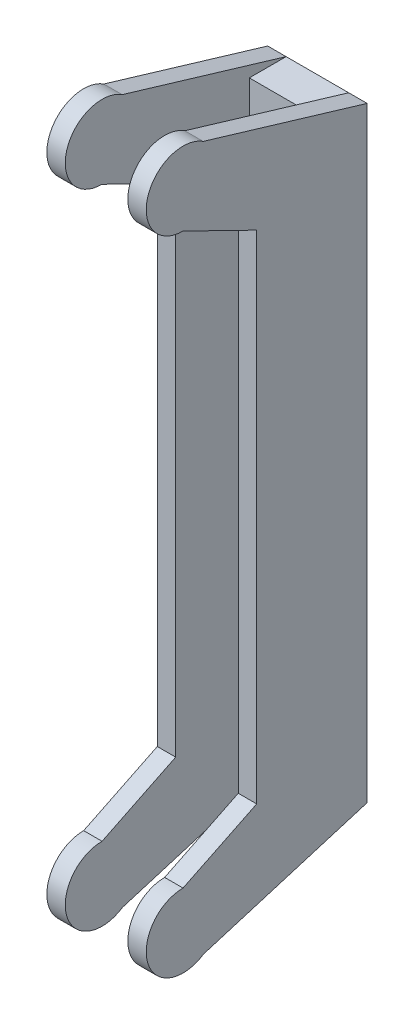
ISO-10303-21;
HEADER;
FILE_DESCRIPTION(('STEP AP214'),'2;1');
FILE_NAME('part.step','',(''),(''),'','','');
FILE_SCHEMA(('AUTOMOTIVE_DESIGN { 1 0 10303 214 1 1 1 1 }'));
ENDSEC;
DATA;
#1=APPLICATION_CONTEXT('core data for automotive mechanical design processes');
#2=APPLICATION_PROTOCOL_DEFINITION('international standard','automotive_design',2000,#1);
#3=PRODUCT_CONTEXT('',#1,'mechanical');
#4=PRODUCT('Part','Part','',(#3));
#5=PRODUCT_RELATED_PRODUCT_CATEGORY('part','',(#4));
#6=PRODUCT_DEFINITION_FORMATION('','',#4);
#7=PRODUCT_DEFINITION_CONTEXT('part definition',#1,'design');
#8=PRODUCT_DEFINITION('design','',#6,#7);
#9=PRODUCT_DEFINITION_SHAPE('','',#8);
#10=(LENGTH_UNIT() NAMED_UNIT(*) SI_UNIT(.MILLI.,.METRE.));
#11=(NAMED_UNIT(*) PLANE_ANGLE_UNIT() SI_UNIT($,.RADIAN.));
#12=(NAMED_UNIT(*) SI_UNIT($,.STERADIAN.) SOLID_ANGLE_UNIT());
#13=UNCERTAINTY_MEASURE_WITH_UNIT(LENGTH_MEASURE(1.E-05),#10,'distance_accuracy_value','');
#14=(GEOMETRIC_REPRESENTATION_CONTEXT(3) GLOBAL_UNCERTAINTY_ASSIGNED_CONTEXT((#13)) GLOBAL_UNIT_ASSIGNED_CONTEXT((#10,
#11,#12)) REPRESENTATION_CONTEXT('',''));
#15=CARTESIAN_POINT('',(0.,0.,0.));
#16=DIRECTION('',(0.,0.,1.));
#17=DIRECTION('',(1.,0.,0.));
#18=AXIS2_PLACEMENT_3D('',#15,#16,#17);
#19=CARTESIAN_POINT('',(1.5,82.25,-4.99999999999999));
#20=DIRECTION('',(0.,-1.,0.));
#21=DIRECTION('',(0.,0.,-1.));
#22=AXIS2_PLACEMENT_3D('',#19,#20,#21);
#23=PLANE('',#22);
#24=DIRECTION('',(0.,0.,-1.));
#25=VECTOR('',#24,1.);
#26=CARTESIAN_POINT('',(-17.,82.25,-4.99999999999999));
#27=LINE('',#26,#25);
#28=CARTESIAN_POINT('',(-17.,82.25,-4.99999999999999));
#29=VERTEX_POINT('',#28);
#30=CARTESIAN_POINT('',(-17.,82.25,-15.));
#31=VERTEX_POINT('',#30);
#32=EDGE_CURVE('E335',#29,#31,#27,.T.);
#33=ORIENTED_EDGE('',*,*,#32,.F.);
#34=DIRECTION('',(-1.,0.,0.));
#35=VECTOR('',#34,1.);
#36=CARTESIAN_POINT('',(1.5,82.25,-4.99999999999999));
#37=LINE('',#36,#35);
#38=CARTESIAN_POINT('',(0.,82.25,-4.99999999999999));
#39=VERTEX_POINT('',#38);
#40=EDGE_CURVE('E346',#39,#29,#37,.T.);
#41=ORIENTED_EDGE('',*,*,#40,.F.);
#42=DIRECTION('',(0.,0.,-1.));
#43=VECTOR('',#42,1.);
#44=CARTESIAN_POINT('',(0.,82.25,35.));
#45=LINE('',#44,#43);
#46=CARTESIAN_POINT('',(0.,82.25,-15.));
#47=VERTEX_POINT('',#46);
#48=EDGE_CURVE('E54',#39,#47,#45,.T.);
#49=ORIENTED_EDGE('',*,*,#48,.T.);
#50=DIRECTION('',(-1.,0.,0.));
#51=VECTOR('',#50,1.);
#52=CARTESIAN_POINT('',(1.5,82.25,-15.));
#53=LINE('',#52,#51);
#54=EDGE_CURVE('E350',#47,#31,#53,.T.);
#55=ORIENTED_EDGE('',*,*,#54,.T.);
#56=EDGE_LOOP('',(#33,#41,#49,#55));
#57=FACE_BOUND('',#56,.T.);
#58=ADVANCED_FACE('F45',(#57),#23,.F.);
#59=CARTESIAN_POINT('',(1.5,-82.25,-4.99999999999999));
#60=DIRECTION('',(0.,0.,-1.));
#61=DIRECTION('',(-1.,0.,0.));
#62=AXIS2_PLACEMENT_3D('',#59,#60,#61);
#63=PLANE('',#62);
#64=DIRECTION('',(-1.,0.,0.));
#65=VECTOR('',#64,1.);
#66=CARTESIAN_POINT('',(1.5,-74.25,-4.99999999999999));
#67=LINE('',#66,#65);
#68=CARTESIAN_POINT('',(-3.,-74.25,-4.99999999999999));
#69=VERTEX_POINT('',#68);
#70=CARTESIAN_POINT('',(-14.,-74.25,-4.99999999999999));
#71=VERTEX_POINT('',#70);
#72=EDGE_CURVE('E214',#69,#71,#67,.T.);
#73=ORIENTED_EDGE('',*,*,#72,.T.);
#74=DIRECTION('',(0.,1.,0.));
#75=VECTOR('',#74,1.);
#76=CARTESIAN_POINT('',(-14.,-82.25,-4.99999999999999));
#77=LINE('',#76,#75);
#78=CARTESIAN_POINT('',(-14.,74.25,-4.99999999999999));
#79=VERTEX_POINT('',#78);
#80=EDGE_CURVE('E200',#71,#79,#77,.T.);
#81=ORIENTED_EDGE('',*,*,#80,.T.);
#82=DIRECTION('',(-1.,0.,0.));
#83=VECTOR('',#82,1.);
#84=CARTESIAN_POINT('',(1.5,74.25,-4.99999999999999));
#85=LINE('',#84,#83);
#86=CARTESIAN_POINT('',(-3.,74.25,-4.99999999999999));
#87=VERTEX_POINT('',#86);
#88=EDGE_CURVE('E225',#87,#79,#85,.T.);
#89=ORIENTED_EDGE('',*,*,#88,.F.);
#90=DIRECTION('',(0.,1.,0.));
#91=VECTOR('',#90,1.);
#92=CARTESIAN_POINT('',(-3.,87.2136800815464,-4.99999999999999));
#93=LINE('',#92,#91);
#94=EDGE_CURVE('E61',#69,#87,#93,.T.);
#95=ORIENTED_EDGE('',*,*,#94,.F.);
#96=EDGE_LOOP('',(#73,#81,#89,#95));
#97=FACE_BOUND('',#96,.T.);
#98=DIRECTION('',(0.,1.,0.));
#99=VECTOR('',#98,1.);
#100=CARTESIAN_POINT('',(-17.,-82.25,-4.99999999999999));
#101=LINE('',#100,#99);
#102=CARTESIAN_POINT('',(-17.,-82.25,-4.99999999999999));
#103=VERTEX_POINT('',#102);
#104=EDGE_CURVE('E332',#103,#29,#101,.T.);
#105=ORIENTED_EDGE('',*,*,#104,.F.);
#106=DIRECTION('',(-1.,0.,0.));
#107=VECTOR('',#106,1.);
#108=CARTESIAN_POINT('',(1.5,-82.25,-4.99999999999999));
#109=LINE('',#108,#107);
#110=CARTESIAN_POINT('',(0.,-82.25,-4.99999999999999));
#111=VERTEX_POINT('',#110);
#112=EDGE_CURVE('E342',#111,#103,#109,.T.);
#113=ORIENTED_EDGE('',*,*,#112,.F.);
#114=DIRECTION('',(0.,1.,0.));
#115=VECTOR('',#114,1.);
#116=CARTESIAN_POINT('',(0.,87.2136800815464,-4.99999999999999));
#117=LINE('',#116,#115);
#118=EDGE_CURVE('E435',#111,#39,#117,.T.);
#119=ORIENTED_EDGE('',*,*,#118,.T.);
#120=ORIENTED_EDGE('',*,*,#40,.T.);
#121=EDGE_LOOP('',(#105,#113,#119,#120));
#122=FACE_BOUND('',#121,.T.);
#123=ADVANCED_FACE('F462',(#97,#122),#63,.F.);
#124=CARTESIAN_POINT('',(1.5,-82.25,-4.99999999999999));
#125=DIRECTION('',(0.,1.,0.));
#126=DIRECTION('',(0.,0.,1.));
#127=AXIS2_PLACEMENT_3D('',#124,#125,#126);
#128=PLANE('',#127);
#129=DIRECTION('',(0.,0.,1.));
#130=VECTOR('',#129,1.);
#131=CARTESIAN_POINT('',(-17.,-82.25,-4.99999999999999));
#132=LINE('',#131,#130);
#133=CARTESIAN_POINT('',(-17.,-82.25,-15.));
#134=VERTEX_POINT('',#133);
#135=EDGE_CURVE('E11',#134,#103,#132,.T.);
#136=ORIENTED_EDGE('',*,*,#135,.F.);
#137=DIRECTION('',(-1.,0.,0.));
#138=VECTOR('',#137,1.);
#139=CARTESIAN_POINT('',(1.5,-82.25,-15.));
#140=LINE('',#139,#138);
#141=CARTESIAN_POINT('',(0.,-82.25,-15.));
#142=VERTEX_POINT('',#141);
#143=EDGE_CURVE('E338',#142,#134,#140,.T.);
#144=ORIENTED_EDGE('',*,*,#143,.F.);
#145=DIRECTION('',(0.,0.,1.));
#146=VECTOR('',#145,1.);
#147=CARTESIAN_POINT('',(0.,-82.25,35.));
#148=LINE('',#147,#146);
#149=EDGE_CURVE('E431',#142,#111,#148,.T.);
#150=ORIENTED_EDGE('',*,*,#149,.T.);
#151=ORIENTED_EDGE('',*,*,#112,.T.);
#152=EDGE_LOOP('',(#136,#144,#150,#151));
#153=FACE_BOUND('',#152,.T.);
#154=ADVANCED_FACE('F470',(#153),#128,.F.);
#155=CARTESIAN_POINT('',(0.,87.2136800815464,35.));
#156=DIRECTION('',(1.,0.,0.));
#157=DIRECTION('',(0.,0.,-1.));
#158=AXIS2_PLACEMENT_3D('',#155,#156,#157);
#159=PLANE('',#158);
#160=ORIENTED_EDGE('',*,*,#48,.F.);
#161=ORIENTED_EDGE('',*,*,#118,.F.);
#162=ORIENTED_EDGE('',*,*,#149,.F.);
#163=DIRECTION('',(0.,0.288688346344575,-0.95742312416446));
#164=VECTOR('',#163,1.);
#165=CARTESIAN_POINT('',(0.,-95.6595006921503,29.4720620306581));
#166=LINE('',#165,#164);
#167=CARTESIAN_POINT('',(0.,-95.6595006921503,29.4720620306581));
#168=VERTEX_POINT('',#167);
#169=EDGE_CURVE('E354',#168,#142,#166,.T.);
#170=ORIENTED_EDGE('',*,*,#169,.F.);
#171=CARTESIAN_POINT('',(0.,-87.3263199184536,35.));
#172=DIRECTION('',(1.,0.,0.));
#173=DIRECTION('',(0.,0.,-1.));
#174=AXIS2_PLACEMENT_3D('',#171,#172,#173);
#175=CIRCLE('',#174,9.99999999999999);
#176=CARTESIAN_POINT('',(0.,-77.3263199184536,35.));
#177=VERTEX_POINT('',#176);
#178=EDGE_CURVE('E360',#177,#168,#175,.T.);
#179=ORIENTED_EDGE('',*,*,#178,.F.);
#180=DIRECTION('',(0.,-0.439526646649904,0.898229551331223));
#181=VECTOR('',#180,1.);
#182=CARTESIAN_POINT('',(0.,-77.3263199184536,35.));
#183=LINE('',#182,#181);
#184=CARTESIAN_POINT('',(0.,-67.5398094212538,15.));
#185=VERTEX_POINT('',#184);
#186=EDGE_CURVE('E397',#185,#177,#183,.T.);
#187=ORIENTED_EDGE('',*,*,#186,.F.);
#188=DIRECTION('',(0.,-1.,0.));
#189=VECTOR('',#188,1.);
#190=CARTESIAN_POINT('',(0.,67.4330888895688,15.));
#191=LINE('',#190,#189);
#192=CARTESIAN_POINT('',(0.,67.4330888895688,15.));
#193=VERTEX_POINT('',#192);
#194=EDGE_CURVE('E394',#193,#185,#191,.T.);
#195=ORIENTED_EDGE('',*,*,#194,.F.);
#196=DIRECTION('',(0.,-0.439312121177508,-0.898334492372701));
#197=VECTOR('',#196,1.);
#198=CARTESIAN_POINT('',(0.,77.2136800815464,35.));
#199=LINE('',#198,#197);
#200=CARTESIAN_POINT('',(0.,77.2136800815464,35.));
#201=VERTEX_POINT('',#200);
#202=EDGE_CURVE('E391',#201,#193,#199,.T.);
#203=ORIENTED_EDGE('',*,*,#202,.F.);
#204=CARTESIAN_POINT('',(0.,87.2136800815464,35.));
#205=DIRECTION('',(1.,0.,0.));
#206=DIRECTION('',(0.,0.,-1.));
#207=AXIS2_PLACEMENT_3D('',#204,#205,#206);
#208=CIRCLE('',#207,10.);
#209=CARTESIAN_POINT('',(0.,95.5696347198065,29.506547344034));
#210=VERTEX_POINT('',#209);
#211=EDGE_CURVE('E388',#210,#201,#208,.T.);
#212=ORIENTED_EDGE('',*,*,#211,.F.);
#213=DIRECTION('',(0.,0.286709379140266,0.958017605220803));
#214=VECTOR('',#213,1.);
#215=CARTESIAN_POINT('',(0.,95.5696347198065,29.506547344034));
#216=LINE('',#215,#214);
#217=EDGE_CURVE('E385',#47,#210,#216,.T.);
#218=ORIENTED_EDGE('',*,*,#217,.F.);
#219=EDGE_LOOP('',(#160,#161,#162,#170,#179,#187,#195,#203,#212,#218));
#220=FACE_BOUND('',#219,.T.);
#221=ADVANCED_FACE('F465',(#220),#159,.F.);
#222=CARTESIAN_POINT('',(5.,-95.6595006921503,29.4720620306581));
#223=DIRECTION('',(0.,0.95742312416446,0.288688346344575));
#224=DIRECTION('',(0.,-0.288688346344575,0.95742312416446));
#225=AXIS2_PLACEMENT_3D('',#222,#223,#224);
#226=PLANE('',#225);
#227=ORIENTED_EDGE('',*,*,#169,.T.);
#228=DIRECTION('',(-1.,0.,0.));
#229=VECTOR('',#228,1.);
#230=CARTESIAN_POINT('',(5.,-82.25,-15.));
#231=LINE('',#230,#229);
#232=CARTESIAN_POINT('',(5.,-82.25,-15.));
#233=VERTEX_POINT('',#232);
#234=EDGE_CURVE('E428',#233,#142,#231,.T.);
#235=ORIENTED_EDGE('',*,*,#234,.F.);
#236=DIRECTION('',(0.,0.288688346344575,-0.95742312416446));
#237=VECTOR('',#236,1.);
#238=CARTESIAN_POINT('',(5.,-95.6595006921503,29.4720620306581));
#239=LINE('',#238,#237);
#240=CARTESIAN_POINT('',(5.,-95.6595006921503,29.4720620306581));
#241=VERTEX_POINT('',#240);
#242=EDGE_CURVE('E355',#241,#233,#239,.T.);
#243=ORIENTED_EDGE('',*,*,#242,.F.);
#244=DIRECTION('',(-1.,0.,0.));
#245=VECTOR('',#244,1.);
#246=CARTESIAN_POINT('',(5.,-95.6595006921503,29.4720620306581));
#247=LINE('',#246,#245);
#248=EDGE_CURVE('E381',#241,#168,#247,.T.);
#249=ORIENTED_EDGE('',*,*,#248,.T.);
#250=EDGE_LOOP('',(#227,#235,#243,#249));
#251=FACE_BOUND('',#250,.T.);
#252=ADVANCED_FACE('F47',(#251),#226,.F.);
#253=CARTESIAN_POINT('',(5.,82.25,-15.));
#254=DIRECTION('',(0.,0.,1.));
#255=DIRECTION('',(0.,-1.,0.));
#256=AXIS2_PLACEMENT_3D('',#253,#254,#255);
#257=PLANE('',#256);
#258=DIRECTION('',(1.,0.,0.));
#259=VECTOR('',#258,1.);
#260=CARTESIAN_POINT('',(-22.,82.25,-15.));
#261=LINE('',#260,#259);
#262=CARTESIAN_POINT('',(-22.,82.25,-15.));
#263=VERTEX_POINT('',#262);
#264=EDGE_CURVE('E325',#263,#31,#261,.T.);
#265=ORIENTED_EDGE('',*,*,#264,.T.);
#266=ORIENTED_EDGE('',*,*,#54,.F.);
#267=DIRECTION('',(-1.,0.,0.));
#268=VECTOR('',#267,1.);
#269=CARTESIAN_POINT('',(5.,82.25,-15.));
#270=LINE('',#269,#268);
#271=CARTESIAN_POINT('',(5.,82.25,-15.));
#272=VERTEX_POINT('',#271);
#273=EDGE_CURVE('E425',#272,#47,#270,.T.);
#274=ORIENTED_EDGE('',*,*,#273,.F.);
#275=DIRECTION('',(0.,1.,0.));
#276=VECTOR('',#275,1.);
#277=CARTESIAN_POINT('',(5.,82.25,-15.));
#278=LINE('',#277,#276);
#279=EDGE_CURVE('E359',#233,#272,#278,.T.);
#280=ORIENTED_EDGE('',*,*,#279,.F.);
#281=ORIENTED_EDGE('',*,*,#234,.T.);
#282=ORIENTED_EDGE('',*,*,#143,.T.);
#283=DIRECTION('',(1.,0.,0.));
#284=VECTOR('',#283,1.);
#285=CARTESIAN_POINT('',(-22.,-82.25,-15.));
#286=LINE('',#285,#284);
#287=CARTESIAN_POINT('',(-22.,-82.25,-15.));
#288=VERTEX_POINT('',#287);
#289=EDGE_CURVE('E329',#288,#134,#286,.T.);
#290=ORIENTED_EDGE('',*,*,#289,.F.);
#291=DIRECTION('',(0.,1.,0.));
#292=VECTOR('',#291,1.);
#293=CARTESIAN_POINT('',(-22.,82.25,-15.));
#294=LINE('',#293,#292);
#295=EDGE_CURVE('E248',#288,#263,#294,.T.);
#296=ORIENTED_EDGE('',*,*,#295,.T.);
#297=EDGE_LOOP('',(#265,#266,#274,#280,#281,#282,#290,#296));
#298=FACE_BOUND('',#297,.T.);
#299=ADVANCED_FACE('F444',(#298),#257,.F.);
#300=CARTESIAN_POINT('',(5.,95.5696347198065,29.506547344034));
#301=DIRECTION('',(0.,-0.958017605220804,0.286709379140266));
#302=DIRECTION('',(0.,-0.286709379140266,-0.958017605220804));
#303=AXIS2_PLACEMENT_3D('',#300,#301,#302);
#304=PLANE('',#303);
#305=ORIENTED_EDGE('',*,*,#217,.T.);
#306=DIRECTION('',(-1.,0.,0.));
#307=VECTOR('',#306,1.);
#308=CARTESIAN_POINT('',(5.,95.5696347198065,29.506547344034));
#309=LINE('',#308,#307);
#310=CARTESIAN_POINT('',(5.,95.5696347198065,29.506547344034));
#311=VERTEX_POINT('',#310);
#312=EDGE_CURVE('E421',#311,#210,#309,.T.);
#313=ORIENTED_EDGE('',*,*,#312,.F.);
#314=DIRECTION('',(0.,0.286709379140266,0.958017605220803));
#315=VECTOR('',#314,1.);
#316=CARTESIAN_POINT('',(5.,95.5696347198065,29.506547344034));
#317=LINE('',#316,#315);
#318=EDGE_CURVE('E363',#272,#311,#317,.T.);
#319=ORIENTED_EDGE('',*,*,#318,.F.);
#320=ORIENTED_EDGE('',*,*,#273,.T.);
#321=EDGE_LOOP('',(#305,#313,#319,#320));
#322=FACE_BOUND('',#321,.T.);
#323=ADVANCED_FACE('F501',(#322),#304,.F.);
#324=CARTESIAN_POINT('',(5.,87.2136800815464,35.));
#325=DIRECTION('',(-1.,0.,0.));
#326=DIRECTION('',(0.,0.,1.));
#327=AXIS2_PLACEMENT_3D('',#324,#325,#326);
#328=CYLINDRICAL_SURFACE('',#327,10.);
#329=ORIENTED_EDGE('',*,*,#211,.T.);
#330=DIRECTION('',(-1.,0.,0.));
#331=VECTOR('',#330,1.);
#332=CARTESIAN_POINT('',(5.,77.2136800815464,35.));
#333=LINE('',#332,#331);
#334=CARTESIAN_POINT('',(5.,77.2136800815464,35.));
#335=VERTEX_POINT('',#334);
#336=EDGE_CURVE('E417',#335,#201,#333,.T.);
#337=ORIENTED_EDGE('',*,*,#336,.F.);
#338=CARTESIAN_POINT('',(5.,87.2136800815464,35.));
#339=DIRECTION('',(1.,0.,0.));
#340=DIRECTION('',(0.,0.,-1.));
#341=AXIS2_PLACEMENT_3D('',#338,#339,#340);
#342=CIRCLE('',#341,10.);
#343=EDGE_CURVE('E366',#311,#335,#342,.T.);
#344=ORIENTED_EDGE('',*,*,#343,.F.);
#345=ORIENTED_EDGE('',*,*,#312,.T.);
#346=EDGE_LOOP('',(#329,#337,#344,#345));
#347=FACE_BOUND('',#346,.T.);
#348=ADVANCED_FACE('F498',(#347),#328,.T.);
#349=CARTESIAN_POINT('',(5.,77.2136800815464,35.));
#350=DIRECTION('',(0.,0.898334492372701,-0.439312121177508));
#351=DIRECTION('',(0.,0.439312121177508,0.898334492372701));
#352=AXIS2_PLACEMENT_3D('',#349,#350,#351);
#353=PLANE('',#352);
#354=ORIENTED_EDGE('',*,*,#202,.T.);
#355=DIRECTION('',(-1.,0.,0.));
#356=VECTOR('',#355,1.);
#357=CARTESIAN_POINT('',(5.,67.4330888895688,15.));
#358=LINE('',#357,#356);
#359=CARTESIAN_POINT('',(5.,67.4330888895688,15.));
#360=VERTEX_POINT('',#359);
#361=EDGE_CURVE('E413',#360,#193,#358,.T.);
#362=ORIENTED_EDGE('',*,*,#361,.F.);
#363=DIRECTION('',(0.,-0.439312121177508,-0.898334492372701));
#364=VECTOR('',#363,1.);
#365=CARTESIAN_POINT('',(5.,77.2136800815464,35.));
#366=LINE('',#365,#364);
#367=EDGE_CURVE('E369',#335,#360,#366,.T.);
#368=ORIENTED_EDGE('',*,*,#367,.F.);
#369=ORIENTED_EDGE('',*,*,#336,.T.);
#370=EDGE_LOOP('',(#354,#362,#368,#369));
#371=FACE_BOUND('',#370,.T.);
#372=ADVANCED_FACE('F493',(#371),#353,.F.);
#373=CARTESIAN_POINT('',(5.,67.4330888895688,15.));
#374=DIRECTION('',(0.,0.,-1.));
#375=DIRECTION('',(0.,1.,0.));
#376=AXIS2_PLACEMENT_3D('',#373,#374,#375);
#377=PLANE('',#376);
#378=ORIENTED_EDGE('',*,*,#194,.T.);
#379=DIRECTION('',(-1.,0.,0.));
#380=VECTOR('',#379,1.);
#381=CARTESIAN_POINT('',(5.,-67.5398094212538,15.));
#382=LINE('',#381,#380);
#383=CARTESIAN_POINT('',(5.,-67.5398094212538,15.));
#384=VERTEX_POINT('',#383);
#385=EDGE_CURVE('E409',#384,#185,#382,.T.);
#386=ORIENTED_EDGE('',*,*,#385,.F.);
#387=DIRECTION('',(0.,-1.,0.));
#388=VECTOR('',#387,1.);
#389=CARTESIAN_POINT('',(5.,67.4330888895688,15.));
#390=LINE('',#389,#388);
#391=EDGE_CURVE('E372',#360,#384,#390,.T.);
#392=ORIENTED_EDGE('',*,*,#391,.F.);
#393=ORIENTED_EDGE('',*,*,#361,.T.);
#394=EDGE_LOOP('',(#378,#386,#392,#393));
#395=FACE_BOUND('',#394,.T.);
#396=ADVANCED_FACE('F488',(#395),#377,.F.);
#397=CARTESIAN_POINT('',(5.,-77.3263199184536,35.));
#398=DIRECTION('',(0.,-0.898229551331223,-0.439526646649904));
#399=DIRECTION('',(0.,0.439526646649904,-0.898229551331223));
#400=AXIS2_PLACEMENT_3D('',#397,#398,#399);
#401=PLANE('',#400);
#402=ORIENTED_EDGE('',*,*,#186,.T.);
#403=DIRECTION('',(-1.,0.,0.));
#404=VECTOR('',#403,1.);
#405=CARTESIAN_POINT('',(5.,-77.3263199184536,35.));
#406=LINE('',#405,#404);
#407=CARTESIAN_POINT('',(5.,-77.3263199184536,35.));
#408=VERTEX_POINT('',#407);
#409=EDGE_CURVE('E405',#408,#177,#406,.T.);
#410=ORIENTED_EDGE('',*,*,#409,.F.);
#411=DIRECTION('',(0.,-0.439526646649904,0.898229551331223));
#412=VECTOR('',#411,1.);
#413=CARTESIAN_POINT('',(5.,-77.3263199184536,35.));
#414=LINE('',#413,#412);
#415=EDGE_CURVE('E375',#384,#408,#414,.T.);
#416=ORIENTED_EDGE('',*,*,#415,.F.);
#417=ORIENTED_EDGE('',*,*,#385,.T.);
#418=EDGE_LOOP('',(#402,#410,#416,#417));
#419=FACE_BOUND('',#418,.T.);
#420=ADVANCED_FACE('F484',(#419),#401,.F.);
#421=CARTESIAN_POINT('',(5.,-87.3263199184536,35.));
#422=DIRECTION('',(-1.,0.,0.));
#423=DIRECTION('',(0.,0.,1.));
#424=AXIS2_PLACEMENT_3D('',#421,#422,#423);
#425=CYLINDRICAL_SURFACE('',#424,9.99999999999999);
#426=ORIENTED_EDGE('',*,*,#178,.T.);
#427=ORIENTED_EDGE('',*,*,#248,.F.);
#428=CARTESIAN_POINT('',(5.,-87.3263199184536,35.));
#429=DIRECTION('',(1.,0.,0.));
#430=DIRECTION('',(0.,0.,-1.));
#431=AXIS2_PLACEMENT_3D('',#428,#429,#430);
#432=CIRCLE('',#431,9.99999999999999);
#433=EDGE_CURVE('E378',#408,#241,#432,.T.);
#434=ORIENTED_EDGE('',*,*,#433,.F.);
#435=ORIENTED_EDGE('',*,*,#409,.T.);
#436=EDGE_LOOP('',(#426,#427,#434,#435));
#437=FACE_BOUND('',#436,.T.);
#438=ADVANCED_FACE('F479',(#437),#425,.T.);
#439=CARTESIAN_POINT('',(5.,87.2136800815464,35.));
#440=DIRECTION('',(1.,0.,0.));
#441=DIRECTION('',(0.,0.,-1.));
#442=AXIS2_PLACEMENT_3D('',#439,#440,#441);
#443=PLANE('',#442);
#444=ORIENTED_EDGE('',*,*,#242,.T.);
#445=ORIENTED_EDGE('',*,*,#279,.T.);
#446=ORIENTED_EDGE('',*,*,#318,.T.);
#447=ORIENTED_EDGE('',*,*,#343,.T.);
#448=ORIENTED_EDGE('',*,*,#367,.T.);
#449=ORIENTED_EDGE('',*,*,#391,.T.);
#450=ORIENTED_EDGE('',*,*,#415,.T.);
#451=ORIENTED_EDGE('',*,*,#433,.T.);
#452=EDGE_LOOP('',(#444,#445,#446,#447,#448,#449,#450,#451));
#453=FACE_BOUND('',#452,.T.);
#454=ADVANCED_FACE('F503',(#453),#443,.T.);
#455=CARTESIAN_POINT('',(-17.,87.2136800815464,35.));
#456=DIRECTION('',(-1.,0.,0.));
#457=DIRECTION('',(0.,0.,-1.));
#458=AXIS2_PLACEMENT_3D('',#455,#456,#457);
#459=PLANE('',#458);
#460=ORIENTED_EDGE('',*,*,#104,.T.);
#461=ORIENTED_EDGE('',*,*,#32,.T.);
#462=DIRECTION('',(0.,0.286709379140266,0.958017605220803));
#463=VECTOR('',#462,1.);
#464=CARTESIAN_POINT('',(-17.,95.5696347198065,29.506547344034));
#465=LINE('',#464,#463);
#466=CARTESIAN_POINT('',(-17.,95.5696347198065,29.506547344034));
#467=VERTEX_POINT('',#466);
#468=EDGE_CURVE('E280',#31,#467,#465,.T.);
#469=ORIENTED_EDGE('',*,*,#468,.T.);
#470=CARTESIAN_POINT('',(-17.,87.2136800815464,35.));
#471=DIRECTION('',(1.,0.,0.));
#472=DIRECTION('',(0.,0.,-1.));
#473=AXIS2_PLACEMENT_3D('',#470,#471,#472);
#474=CIRCLE('',#473,10.);
#475=CARTESIAN_POINT('',(-17.,77.2136800815464,35.));
#476=VERTEX_POINT('',#475);
#477=EDGE_CURVE('E284',#467,#476,#474,.T.);
#478=ORIENTED_EDGE('',*,*,#477,.T.);
#479=DIRECTION('',(0.,-0.439312121177508,-0.898334492372701));
#480=VECTOR('',#479,1.);
#481=CARTESIAN_POINT('',(-17.,77.2136800815464,35.));
#482=LINE('',#481,#480);
#483=CARTESIAN_POINT('',(-17.,67.4330888895688,15.));
#484=VERTEX_POINT('',#483);
#485=EDGE_CURVE('E288',#476,#484,#482,.T.);
#486=ORIENTED_EDGE('',*,*,#485,.T.);
#487=DIRECTION('',(0.,-1.,0.));
#488=VECTOR('',#487,1.);
#489=CARTESIAN_POINT('',(-17.,67.4330888895688,15.));
#490=LINE('',#489,#488);
#491=CARTESIAN_POINT('',(-17.,-67.5398094212538,15.));
#492=VERTEX_POINT('',#491);
#493=EDGE_CURVE('E292',#484,#492,#490,.T.);
#494=ORIENTED_EDGE('',*,*,#493,.T.);
#495=DIRECTION('',(0.,-0.439526646649904,0.898229551331223));
#496=VECTOR('',#495,1.);
#497=CARTESIAN_POINT('',(-17.,-77.3263199184536,35.));
#498=LINE('',#497,#496);
#499=CARTESIAN_POINT('',(-17.,-77.3263199184536,35.));
#500=VERTEX_POINT('',#499);
#501=EDGE_CURVE('E296',#492,#500,#498,.T.);
#502=ORIENTED_EDGE('',*,*,#501,.T.);
#503=CARTESIAN_POINT('',(-17.,-87.3263199184536,35.));
#504=DIRECTION('',(1.,0.,0.));
#505=DIRECTION('',(0.,0.,-1.));
#506=AXIS2_PLACEMENT_3D('',#503,#504,#505);
#507=CIRCLE('',#506,9.99999999999999);
#508=CARTESIAN_POINT('',(-17.,-95.6595006921503,29.4720620306581));
#509=VERTEX_POINT('',#508);
#510=EDGE_CURVE('E249',#500,#509,#507,.T.);
#511=ORIENTED_EDGE('',*,*,#510,.T.);
#512=DIRECTION('',(0.,0.288688346344575,-0.95742312416446));
#513=VECTOR('',#512,1.);
#514=CARTESIAN_POINT('',(-17.,-95.6595006921503,29.4720620306581));
#515=LINE('',#514,#513);
#516=EDGE_CURVE('E243',#509,#134,#515,.T.);
#517=ORIENTED_EDGE('',*,*,#516,.T.);
#518=ORIENTED_EDGE('',*,*,#135,.T.);
#519=EDGE_LOOP('',(#460,#461,#469,#478,#486,#494,#502,#511,#517,#518));
#520=FACE_BOUND('',#519,.T.);
#521=ADVANCED_FACE('F459',(#520),#459,.F.);
#522=CARTESIAN_POINT('',(-22.,-95.6595006921503,29.4720620306581));
#523=DIRECTION('',(0.,0.95742312416446,0.288688346344575));
#524=DIRECTION('',(0.,-0.288688346344575,0.95742312416446));
#525=AXIS2_PLACEMENT_3D('',#522,#523,#524);
#526=PLANE('',#525);
#527=ORIENTED_EDGE('',*,*,#516,.F.);
#528=DIRECTION('',(1.,0.,0.));
#529=VECTOR('',#528,1.);
#530=CARTESIAN_POINT('',(-22.,-95.6595006921503,29.4720620306581));
#531=LINE('',#530,#529);
#532=CARTESIAN_POINT('',(-22.,-95.6595006921503,29.4720620306581));
#533=VERTEX_POINT('',#532);
#534=EDGE_CURVE('E276',#533,#509,#531,.T.);
#535=ORIENTED_EDGE('',*,*,#534,.F.);
#536=DIRECTION('',(0.,0.288688346344575,-0.95742312416446));
#537=VECTOR('',#536,1.);
#538=CARTESIAN_POINT('',(-22.,-95.6595006921503,29.4720620306581));
#539=LINE('',#538,#537);
#540=EDGE_CURVE('E244',#533,#288,#539,.T.);
#541=ORIENTED_EDGE('',*,*,#540,.T.);
#542=ORIENTED_EDGE('',*,*,#289,.T.);
#543=EDGE_LOOP('',(#527,#535,#541,#542));
#544=FACE_BOUND('',#543,.T.);
#545=ADVANCED_FACE('F511',(#544),#526,.F.);
#546=CARTESIAN_POINT('',(-22.,95.5696347198065,29.506547344034));
#547=DIRECTION('',(0.,-0.958017605220804,0.286709379140266));
#548=DIRECTION('',(0.,-0.286709379140266,-0.958017605220804));
#549=AXIS2_PLACEMENT_3D('',#546,#547,#548);
#550=PLANE('',#549);
#551=ORIENTED_EDGE('',*,*,#468,.F.);
#552=ORIENTED_EDGE('',*,*,#264,.F.);
#553=DIRECTION('',(0.,0.286709379140266,0.958017605220803));
#554=VECTOR('',#553,1.);
#555=CARTESIAN_POINT('',(-22.,95.5696347198065,29.506547344034));
#556=LINE('',#555,#554);
#557=CARTESIAN_POINT('',(-22.,95.5696347198065,29.506547344034));
#558=VERTEX_POINT('',#557);
#559=EDGE_CURVE('E253',#263,#558,#556,.T.);
#560=ORIENTED_EDGE('',*,*,#559,.T.);
#561=DIRECTION('',(1.,0.,0.));
#562=VECTOR('',#561,1.);
#563=CARTESIAN_POINT('',(-22.,95.5696347198065,29.506547344034));
#564=LINE('',#563,#562);
#565=EDGE_CURVE('E321',#558,#467,#564,.T.);
#566=ORIENTED_EDGE('',*,*,#565,.T.);
#567=EDGE_LOOP('',(#551,#552,#560,#566));
#568=FACE_BOUND('',#567,.T.);
#569=ADVANCED_FACE('F450',(#568),#550,.F.);
#570=CARTESIAN_POINT('',(-22.,87.2136800815464,35.));
#571=DIRECTION('',(1.,0.,0.));
#572=DIRECTION('',(0.,0.,1.));
#573=AXIS2_PLACEMENT_3D('',#570,#571,#572);
#574=CYLINDRICAL_SURFACE('',#573,10.);
#575=ORIENTED_EDGE('',*,*,#477,.F.);
#576=ORIENTED_EDGE('',*,*,#565,.F.);
#577=CARTESIAN_POINT('',(-22.,87.2136800815464,35.));
#578=DIRECTION('',(1.,0.,0.));
#579=DIRECTION('',(0.,0.,-1.));
#580=AXIS2_PLACEMENT_3D('',#577,#578,#579);
#581=CIRCLE('',#580,10.);
#582=CARTESIAN_POINT('',(-22.,77.2136800815464,35.));
#583=VERTEX_POINT('',#582);
#584=EDGE_CURVE('E257',#558,#583,#581,.T.);
#585=ORIENTED_EDGE('',*,*,#584,.T.);
#586=DIRECTION('',(1.,0.,0.));
#587=VECTOR('',#586,1.);
#588=CARTESIAN_POINT('',(-22.,77.2136800815464,35.));
#589=LINE('',#588,#587);
#590=EDGE_CURVE('E317',#583,#476,#589,.T.);
#591=ORIENTED_EDGE('',*,*,#590,.T.);
#592=EDGE_LOOP('',(#575,#576,#585,#591));
#593=FACE_BOUND('',#592,.T.);
#594=ADVANCED_FACE('F457',(#593),#574,.T.);
#595=CARTESIAN_POINT('',(-22.,77.2136800815464,35.));
#596=DIRECTION('',(0.,0.898334492372701,-0.439312121177508));
#597=DIRECTION('',(0.,0.439312121177508,0.898334492372701));
#598=AXIS2_PLACEMENT_3D('',#595,#596,#597);
#599=PLANE('',#598);
#600=ORIENTED_EDGE('',*,*,#485,.F.);
#601=ORIENTED_EDGE('',*,*,#590,.F.);
#602=DIRECTION('',(0.,-0.439312121177508,-0.898334492372701));
#603=VECTOR('',#602,1.);
#604=CARTESIAN_POINT('',(-22.,77.2136800815464,35.));
#605=LINE('',#604,#603);
#606=CARTESIAN_POINT('',(-22.,67.4330888895688,15.));
#607=VERTEX_POINT('',#606);
#608=EDGE_CURVE('E261',#583,#607,#605,.T.);
#609=ORIENTED_EDGE('',*,*,#608,.T.);
#610=DIRECTION('',(1.,0.,0.));
#611=VECTOR('',#610,1.);
#612=CARTESIAN_POINT('',(-22.,67.4330888895688,15.));
#613=LINE('',#612,#611);
#614=EDGE_CURVE('E313',#607,#484,#613,.T.);
#615=ORIENTED_EDGE('',*,*,#614,.T.);
#616=EDGE_LOOP('',(#600,#601,#609,#615));
#617=FACE_BOUND('',#616,.T.);
#618=ADVANCED_FACE('F531',(#617),#599,.F.);
#619=CARTESIAN_POINT('',(-22.,67.4330888895688,15.));
#620=DIRECTION('',(0.,0.,-1.));
#621=DIRECTION('',(0.,1.,0.));
#622=AXIS2_PLACEMENT_3D('',#619,#620,#621);
#623=PLANE('',#622);
#624=ORIENTED_EDGE('',*,*,#493,.F.);
#625=ORIENTED_EDGE('',*,*,#614,.F.);
#626=DIRECTION('',(0.,-1.,0.));
#627=VECTOR('',#626,1.);
#628=CARTESIAN_POINT('',(-22.,67.4330888895688,15.));
#629=LINE('',#628,#627);
#630=CARTESIAN_POINT('',(-22.,-67.5398094212538,15.));
#631=VERTEX_POINT('',#630);
#632=EDGE_CURVE('E265',#607,#631,#629,.T.);
#633=ORIENTED_EDGE('',*,*,#632,.T.);
#634=DIRECTION('',(1.,0.,0.));
#635=VECTOR('',#634,1.);
#636=CARTESIAN_POINT('',(-22.,-67.5398094212538,15.));
#637=LINE('',#636,#635);
#638=EDGE_CURVE('E309',#631,#492,#637,.T.);
#639=ORIENTED_EDGE('',*,*,#638,.T.);
#640=EDGE_LOOP('',(#624,#625,#633,#639));
#641=FACE_BOUND('',#640,.T.);
#642=ADVANCED_FACE('F534',(#641),#623,.F.);
#643=CARTESIAN_POINT('',(-22.,-77.3263199184536,35.));
#644=DIRECTION('',(0.,-0.898229551331223,-0.439526646649904));
#645=DIRECTION('',(0.,0.439526646649904,-0.898229551331223));
#646=AXIS2_PLACEMENT_3D('',#643,#644,#645);
#647=PLANE('',#646);
#648=ORIENTED_EDGE('',*,*,#501,.F.);
#649=ORIENTED_EDGE('',*,*,#638,.F.);
#650=DIRECTION('',(0.,-0.439526646649904,0.898229551331223));
#651=VECTOR('',#650,1.);
#652=CARTESIAN_POINT('',(-22.,-77.3263199184536,35.));
#653=LINE('',#652,#651);
#654=CARTESIAN_POINT('',(-22.,-77.3263199184536,35.));
#655=VERTEX_POINT('',#654);
#656=EDGE_CURVE('E269',#631,#655,#653,.T.);
#657=ORIENTED_EDGE('',*,*,#656,.T.);
#658=DIRECTION('',(1.,0.,0.));
#659=VECTOR('',#658,1.);
#660=CARTESIAN_POINT('',(-22.,-77.3263199184536,35.));
#661=LINE('',#660,#659);
#662=EDGE_CURVE('E305',#655,#500,#661,.T.);
#663=ORIENTED_EDGE('',*,*,#662,.T.);
#664=EDGE_LOOP('',(#648,#649,#657,#663));
#665=FACE_BOUND('',#664,.T.);
#666=ADVANCED_FACE('F538',(#665),#647,.F.);
#667=CARTESIAN_POINT('',(-22.,-87.3263199184536,35.));
#668=DIRECTION('',(1.,0.,0.));
#669=DIRECTION('',(0.,0.,1.));
#670=AXIS2_PLACEMENT_3D('',#667,#668,#669);
#671=CYLINDRICAL_SURFACE('',#670,9.99999999999999);
#672=ORIENTED_EDGE('',*,*,#510,.F.);
#673=ORIENTED_EDGE('',*,*,#662,.F.);
#674=CARTESIAN_POINT('',(-22.,-87.3263199184536,35.));
#675=DIRECTION('',(1.,0.,0.));
#676=DIRECTION('',(0.,0.,-1.));
#677=AXIS2_PLACEMENT_3D('',#674,#675,#676);
#678=CIRCLE('',#677,9.99999999999999);
#679=EDGE_CURVE('E273',#655,#533,#678,.T.);
#680=ORIENTED_EDGE('',*,*,#679,.T.);
#681=ORIENTED_EDGE('',*,*,#534,.T.);
#682=EDGE_LOOP('',(#672,#673,#680,#681));
#683=FACE_BOUND('',#682,.T.);
#684=ADVANCED_FACE('F542',(#683),#671,.T.);
#685=CARTESIAN_POINT('',(-22.,87.2136800815464,35.));
#686=DIRECTION('',(-1.,0.,0.));
#687=DIRECTION('',(0.,0.,-1.));
#688=AXIS2_PLACEMENT_3D('',#685,#686,#687);
#689=PLANE('',#688);
#690=ORIENTED_EDGE('',*,*,#540,.F.);
#691=ORIENTED_EDGE('',*,*,#679,.F.);
#692=ORIENTED_EDGE('',*,*,#656,.F.);
#693=ORIENTED_EDGE('',*,*,#632,.F.);
#694=ORIENTED_EDGE('',*,*,#608,.F.);
#695=ORIENTED_EDGE('',*,*,#584,.F.);
#696=ORIENTED_EDGE('',*,*,#559,.F.);
#697=ORIENTED_EDGE('',*,*,#295,.F.);
#698=EDGE_LOOP('',(#690,#691,#692,#693,#694,#695,#696,#697));
#699=FACE_BOUND('',#698,.T.);
#700=ADVANCED_FACE('F453',(#699),#689,.T.);
#701=CARTESIAN_POINT('',(1.5,74.25,-4.99999999999999));
#702=DIRECTION('',(0.,-1.,0.));
#703=DIRECTION('',(0.,0.,-1.));
#704=AXIS2_PLACEMENT_3D('',#701,#702,#703);
#705=PLANE('',#704);
#706=DIRECTION('',(0.,0.,-1.));
#707=VECTOR('',#706,1.);
#708=CARTESIAN_POINT('',(-14.,74.25,-4.99999999999999));
#709=LINE('',#708,#707);
#710=CARTESIAN_POINT('',(-14.,74.25,-6.99999999999999));
#711=VERTEX_POINT('',#710);
#712=EDGE_CURVE('E234',#79,#711,#709,.T.);
#713=ORIENTED_EDGE('',*,*,#712,.T.);
#714=DIRECTION('',(-1.,0.,0.));
#715=VECTOR('',#714,1.);
#716=CARTESIAN_POINT('',(1.5,74.25,-6.99999999999999));
#717=LINE('',#716,#715);
#718=CARTESIAN_POINT('',(-3.,74.25,-6.99999999999999));
#719=VERTEX_POINT('',#718);
#720=EDGE_CURVE('E219',#719,#711,#717,.T.);
#721=ORIENTED_EDGE('',*,*,#720,.F.);
#722=DIRECTION('',(0.,0.,-1.));
#723=VECTOR('',#722,1.);
#724=CARTESIAN_POINT('',(-3.,74.25,35.));
#725=LINE('',#724,#723);
#726=EDGE_CURVE('E231',#87,#719,#725,.T.);
#727=ORIENTED_EDGE('',*,*,#726,.F.);
#728=ORIENTED_EDGE('',*,*,#88,.T.);
#729=EDGE_LOOP('',(#713,#721,#727,#728));
#730=FACE_BOUND('',#729,.T.);
#731=ADVANCED_FACE('F549',(#730),#705,.T.);
#732=CARTESIAN_POINT('',(1.5,-74.25,-4.99999999999999));
#733=DIRECTION('',(0.,1.,0.));
#734=DIRECTION('',(0.,0.,1.));
#735=AXIS2_PLACEMENT_3D('',#732,#733,#734);
#736=PLANE('',#735);
#737=ORIENTED_EDGE('',*,*,#72,.F.);
#738=DIRECTION('',(0.,0.,-1.));
#739=VECTOR('',#738,1.);
#740=CARTESIAN_POINT('',(-3.,-74.25,-4.99999999999999));
#741=LINE('',#740,#739);
#742=CARTESIAN_POINT('',(-3.,-74.25,-7.00000000000001));
#743=VERTEX_POINT('',#742);
#744=EDGE_CURVE('E205',#69,#743,#741,.T.);
#745=ORIENTED_EDGE('',*,*,#744,.T.);
#746=DIRECTION('',(-1.,0.,0.));
#747=VECTOR('',#746,1.);
#748=CARTESIAN_POINT('',(5.,-74.25,-7.00000000000001));
#749=LINE('',#748,#747);
#750=CARTESIAN_POINT('',(-14.,-74.25,-7.));
#751=VERTEX_POINT('',#750);
#752=EDGE_CURVE('E208',#743,#751,#749,.T.);
#753=ORIENTED_EDGE('',*,*,#752,.T.);
#754=DIRECTION('',(0.,0.,-1.));
#755=VECTOR('',#754,1.);
#756=CARTESIAN_POINT('',(-14.,-74.25,35.));
#757=LINE('',#756,#755);
#758=EDGE_CURVE('E194',#71,#751,#757,.T.);
#759=ORIENTED_EDGE('',*,*,#758,.F.);
#760=EDGE_LOOP('',(#737,#745,#753,#759));
#761=FACE_BOUND('',#760,.T.);
#762=ADVANCED_FACE('F209',(#761),#736,.T.);
#763=CARTESIAN_POINT('',(5.,82.25,-6.99999999999999));
#764=DIRECTION('',(0.,0.,1.));
#765=DIRECTION('',(0.,-1.,0.));
#766=AXIS2_PLACEMENT_3D('',#763,#764,#765);
#767=PLANE('',#766);
#768=DIRECTION('',(0.,1.,0.));
#769=VECTOR('',#768,1.);
#770=CARTESIAN_POINT('',(-14.,87.2136800815464,-6.99999999999999));
#771=LINE('',#770,#769);
#772=EDGE_CURVE('E198',#751,#711,#771,.T.);
#773=ORIENTED_EDGE('',*,*,#772,.F.);
#774=ORIENTED_EDGE('',*,*,#752,.F.);
#775=DIRECTION('',(0.,1.,0.));
#776=VECTOR('',#775,1.);
#777=CARTESIAN_POINT('',(-3.,82.25,-6.99999999999999));
#778=LINE('',#777,#776);
#779=EDGE_CURVE('E224',#743,#719,#778,.T.);
#780=ORIENTED_EDGE('',*,*,#779,.T.);
#781=ORIENTED_EDGE('',*,*,#720,.T.);
#782=EDGE_LOOP('',(#773,#774,#780,#781));
#783=FACE_BOUND('',#782,.T.);
#784=ADVANCED_FACE('F217',(#783),#767,.T.);
#785=CARTESIAN_POINT('',(-3.,87.2136800815464,35.));
#786=DIRECTION('',(1.,0.,0.));
#787=DIRECTION('',(0.,0.,-1.));
#788=AXIS2_PLACEMENT_3D('',#785,#786,#787);
#789=PLANE('',#788);
#790=ORIENTED_EDGE('',*,*,#94,.T.);
#791=ORIENTED_EDGE('',*,*,#726,.T.);
#792=ORIENTED_EDGE('',*,*,#779,.F.);
#793=ORIENTED_EDGE('',*,*,#744,.F.);
#794=EDGE_LOOP('',(#790,#791,#792,#793));
#795=FACE_BOUND('',#794,.T.);
#796=ADVANCED_FACE('F552',(#795),#789,.F.);
#797=CARTESIAN_POINT('',(-14.,87.2136800815464,35.));
#798=DIRECTION('',(-1.,0.,0.));
#799=DIRECTION('',(0.,0.,-1.));
#800=AXIS2_PLACEMENT_3D('',#797,#798,#799);
#801=PLANE('',#800);
#802=ORIENTED_EDGE('',*,*,#758,.T.);
#803=ORIENTED_EDGE('',*,*,#772,.T.);
#804=ORIENTED_EDGE('',*,*,#712,.F.);
#805=ORIENTED_EDGE('',*,*,#80,.F.);
#806=EDGE_LOOP('',(#802,#803,#804,#805));
#807=FACE_BOUND('',#806,.T.);
#808=ADVANCED_FACE('F196',(#807),#801,.F.);
#809=CLOSED_SHELL('',(#58,#123,#154,#221,#252,#299,#323,#348,#372,#396,#420,#438,#454,#521,#545,
#569,#594,#618,#642,#666,#684,#700,#731,#762,#784,#796,#808));
#810=MANIFOLD_SOLID_BREP('B2',#809);
#811=ADVANCED_BREP_SHAPE_REPRESENTATION('',(#18,#810),#14);
#812=SHAPE_DEFINITION_REPRESENTATION(#9,#811);
ENDSEC;
END-ISO-10303-21;
